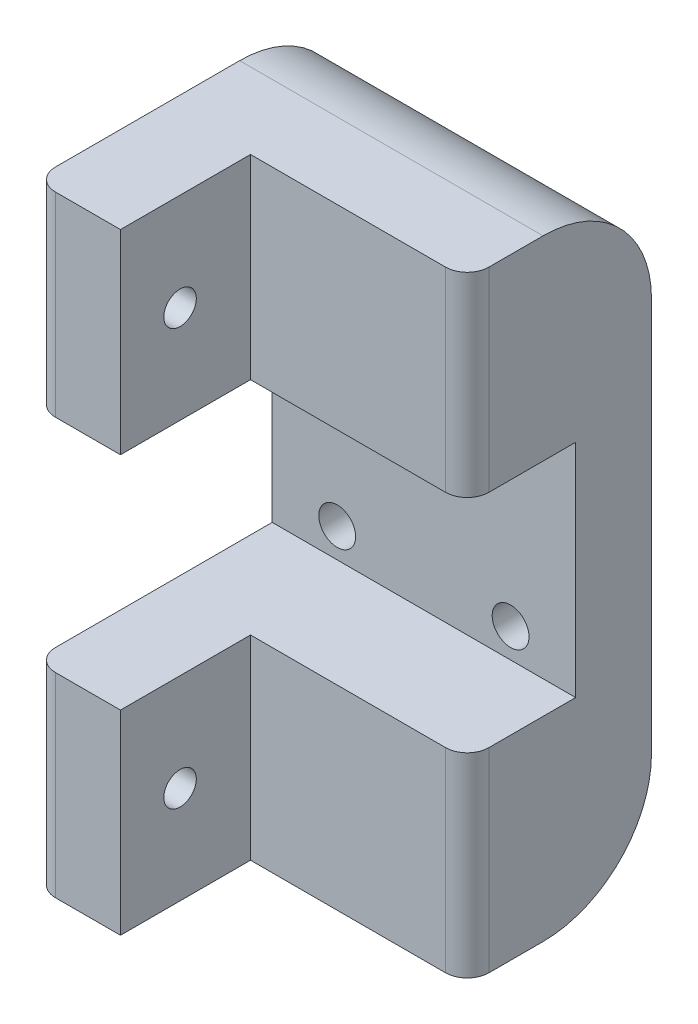
ISO-10303-21;
HEADER;
FILE_DESCRIPTION(('STEP AP214'),'2;1');
FILE_NAME('part.step','',(''),(''),'','','');
FILE_SCHEMA(('AUTOMOTIVE_DESIGN { 1 0 10303 214 1 1 1 1 }'));
ENDSEC;
DATA;
#1=APPLICATION_CONTEXT('core data for automotive mechanical design processes');
#2=APPLICATION_PROTOCOL_DEFINITION('international standard','automotive_design',2000,#1);
#3=PRODUCT_CONTEXT('',#1,'mechanical');
#4=PRODUCT('Part','Part','',(#3));
#5=PRODUCT_RELATED_PRODUCT_CATEGORY('part','',(#4));
#6=PRODUCT_DEFINITION_FORMATION('','',#4);
#7=PRODUCT_DEFINITION_CONTEXT('part definition',#1,'design');
#8=PRODUCT_DEFINITION('design','',#6,#7);
#9=PRODUCT_DEFINITION_SHAPE('','',#8);
#10=(LENGTH_UNIT() NAMED_UNIT(*) SI_UNIT(.MILLI.,.METRE.));
#11=(NAMED_UNIT(*) PLANE_ANGLE_UNIT() SI_UNIT($,.RADIAN.));
#12=(NAMED_UNIT(*) SI_UNIT($,.STERADIAN.) SOLID_ANGLE_UNIT());
#13=UNCERTAINTY_MEASURE_WITH_UNIT(LENGTH_MEASURE(1.E-05),#10,'distance_accuracy_value','');
#14=(GEOMETRIC_REPRESENTATION_CONTEXT(3) GLOBAL_UNCERTAINTY_ASSIGNED_CONTEXT((#13)) GLOBAL_UNIT_ASSIGNED_CONTEXT((#10,
#11,#12)) REPRESENTATION_CONTEXT('',''));
#15=CARTESIAN_POINT('',(0.,0.,0.));
#16=DIRECTION('',(0.,0.,1.));
#17=DIRECTION('',(1.,0.,0.));
#18=AXIS2_PLACEMENT_3D('',#15,#16,#17);
#19=CARTESIAN_POINT('',(0.,-18.,17.));
#20=DIRECTION('',(0.,0.,-1.));
#21=DIRECTION('',(-1.,0.,0.));
#22=AXIS2_PLACEMENT_3D('',#19,#20,#21);
#23=PLANE('',#22);
#24=DIRECTION('',(-1.,0.,0.));
#25=VECTOR('',#24,1.);
#26=CARTESIAN_POINT('',(0.,-18.,17.));
#27=LINE('',#26,#25);
#28=CARTESIAN_POINT('',(26.,-18.,17.));
#29=VERTEX_POINT('',#28);
#30=CARTESIAN_POINT('',(8.00000000000001,-18.,17.));
#31=VERTEX_POINT('',#30);
#32=EDGE_CURVE('E171',#29,#31,#27,.T.);
#33=ORIENTED_EDGE('',*,*,#32,.F.);
#34=DIRECTION('',(0.,1.,0.));
#35=VECTOR('',#34,1.);
#36=CARTESIAN_POINT('',(26.,-18.,17.));
#37=LINE('',#36,#35);
#38=CARTESIAN_POINT('',(26.,0.,17.));
#39=VERTEX_POINT('',#38);
#40=EDGE_CURVE('E327',#29,#39,#37,.T.);
#41=ORIENTED_EDGE('',*,*,#40,.T.);
#42=DIRECTION('',(-1.,0.,0.));
#43=VECTOR('',#42,1.);
#44=CARTESIAN_POINT('',(0.,0.,17.));
#45=LINE('',#44,#43);
#46=CARTESIAN_POINT('',(8.00000000000001,0.,17.));
#47=VERTEX_POINT('',#46);
#48=EDGE_CURVE('E235',#39,#47,#45,.T.);
#49=ORIENTED_EDGE('',*,*,#48,.T.);
#50=DIRECTION('',(0.,1.,0.));
#51=VECTOR('',#50,1.);
#52=CARTESIAN_POINT('',(8.00000000000001,0.,17.));
#53=LINE('',#52,#51);
#54=EDGE_CURVE('E164',#31,#47,#53,.T.);
#55=ORIENTED_EDGE('',*,*,#54,.F.);
#56=EDGE_LOOP('',(#33,#41,#49,#55));
#57=FACE_BOUND('',#56,.T.);
#58=ADVANCED_FACE('F35',(#57),#23,.F.);
#59=CARTESIAN_POINT('',(0.,38.4,17.));
#60=DIRECTION('',(0.,0.,-1.));
#61=DIRECTION('',(-1.,0.,0.));
#62=AXIS2_PLACEMENT_3D('',#59,#60,#61);
#63=PLANE('',#62);
#64=DIRECTION('',(1.,0.,0.));
#65=VECTOR('',#64,1.);
#66=CARTESIAN_POINT('',(0.,20.4,17.));
#67=LINE('',#66,#65);
#68=CARTESIAN_POINT('',(8.,20.4,17.));
#69=VERTEX_POINT('',#68);
#70=CARTESIAN_POINT('',(26.,20.4,17.));
#71=VERTEX_POINT('',#70);
#72=EDGE_CURVE('E257',#69,#71,#67,.T.);
#73=ORIENTED_EDGE('',*,*,#72,.T.);
#74=DIRECTION('',(0.,-1.,0.));
#75=VECTOR('',#74,1.);
#76=CARTESIAN_POINT('',(26.,38.4,17.));
#77=LINE('',#76,#75);
#78=CARTESIAN_POINT('',(26.,38.4,17.));
#79=VERTEX_POINT('',#78);
#80=EDGE_CURVE('E321',#71,#79,#77,.F.);
#81=ORIENTED_EDGE('',*,*,#80,.T.);
#82=DIRECTION('',(1.,0.,0.));
#83=VECTOR('',#82,1.);
#84=CARTESIAN_POINT('',(0.,38.4,17.));
#85=LINE('',#84,#83);
#86=CARTESIAN_POINT('',(8.,38.4,17.));
#87=VERTEX_POINT('',#86);
#88=EDGE_CURVE('E248',#87,#79,#85,.T.);
#89=ORIENTED_EDGE('',*,*,#88,.F.);
#90=DIRECTION('',(0.,1.,0.));
#91=VECTOR('',#90,1.);
#92=CARTESIAN_POINT('',(8.,38.4,17.));
#93=LINE('',#92,#91);
#94=EDGE_CURVE('E175',#69,#87,#93,.T.);
#95=ORIENTED_EDGE('',*,*,#94,.F.);
#96=EDGE_LOOP('',(#73,#81,#89,#95));
#97=FACE_BOUND('',#96,.T.);
#98=ADVANCED_FACE('F418',(#97),#63,.F.);
#99=CARTESIAN_POINT('',(0.,0.,7.));
#100=DIRECTION('',(1.,0.,0.));
#101=DIRECTION('',(0.,0.,-1.));
#102=AXIS2_PLACEMENT_3D('',#99,#100,#101);
#103=PLANE('',#102);
#104=CARTESIAN_POINT('',(0.,29.4,23.5));
#105=DIRECTION('',(-1.,0.,0.));
#106=DIRECTION('',(0.,0.,1.));
#107=AXIS2_PLACEMENT_3D('',#104,#105,#106);
#108=CIRCLE('',#107,1.5);
#109=CARTESIAN_POINT('',(0.,29.4,25.));
#110=VERTEX_POINT('',#109);
#111=EDGE_CURVE('E310',#110,#110,#108,.T.);
#112=ORIENTED_EDGE('',*,*,#111,.F.);
#113=EDGE_LOOP('',(#112));
#114=FACE_BOUND('',#113,.T.);
#115=CARTESIAN_POINT('',(0.,-9.,23.5));
#116=DIRECTION('',(-1.,0.,0.));
#117=DIRECTION('',(0.,0.,1.));
#118=AXIS2_PLACEMENT_3D('',#115,#116,#117);
#119=CIRCLE('',#118,1.5);
#120=CARTESIAN_POINT('',(0.,-9.,25.));
#121=VERTEX_POINT('',#120);
#122=EDGE_CURVE('E447',#121,#121,#119,.T.);
#123=ORIENTED_EDGE('',*,*,#122,.F.);
#124=EDGE_LOOP('',(#123));
#125=FACE_BOUND('',#124,.T.);
#126=DIRECTION('',(0.,0.,1.));
#127=VECTOR('',#126,1.);
#128=CARTESIAN_POINT('',(0.,20.4,0.));
#129=LINE('',#128,#127);
#130=CARTESIAN_POINT('',(0.,20.4,7.));
#131=VERTEX_POINT('',#130);
#132=CARTESIAN_POINT('',(0.,20.4,27.));
#133=VERTEX_POINT('',#132);
#134=EDGE_CURVE('E238',#131,#133,#129,.T.);
#135=ORIENTED_EDGE('',*,*,#134,.T.);
#136=DIRECTION('',(0.,-1.,0.));
#137=VECTOR('',#136,1.);
#138=CARTESIAN_POINT('',(0.,38.4,27.));
#139=LINE('',#138,#137);
#140=CARTESIAN_POINT('',(0.,38.4,27.));
#141=VERTEX_POINT('',#140);
#142=EDGE_CURVE('E43',#133,#141,#139,.F.);
#143=ORIENTED_EDGE('',*,*,#142,.T.);
#144=DIRECTION('',(0.,0.,1.));
#145=VECTOR('',#144,1.);
#146=CARTESIAN_POINT('',(0.,38.4,0.));
#147=LINE('',#146,#145);
#148=CARTESIAN_POINT('',(0.,38.4,10.));
#149=VERTEX_POINT('',#148);
#150=EDGE_CURVE('E245',#149,#141,#147,.T.);
#151=ORIENTED_EDGE('',*,*,#150,.F.);
#152=CARTESIAN_POINT('',(0.,28.4,10.));
#153=DIRECTION('',(1.,0.,0.));
#154=DIRECTION('',(0.,0.,-1.));
#155=AXIS2_PLACEMENT_3D('',#152,#153,#154);
#156=CIRCLE('',#155,10.);
#157=CARTESIAN_POINT('',(0.,28.4,0.));
#158=VERTEX_POINT('',#157);
#159=EDGE_CURVE('E298',#149,#158,#156,.F.);
#160=ORIENTED_EDGE('',*,*,#159,.T.);
#161=DIRECTION('',(0.,-1.,0.));
#162=VECTOR('',#161,1.);
#163=CARTESIAN_POINT('',(0.,0.,0.));
#164=LINE('',#163,#162);
#165=CARTESIAN_POINT('',(0.,-8.,0.));
#166=VERTEX_POINT('',#165);
#167=EDGE_CURVE('E254',#158,#166,#164,.T.);
#168=ORIENTED_EDGE('',*,*,#167,.T.);
#169=CARTESIAN_POINT('',(0.,-8.,10.));
#170=DIRECTION('',(1.,0.,0.));
#171=DIRECTION('',(0.,0.,-1.));
#172=AXIS2_PLACEMENT_3D('',#169,#170,#171);
#173=CIRCLE('',#172,10.);
#174=CARTESIAN_POINT('',(0.,-18.,10.));
#175=VERTEX_POINT('',#174);
#176=EDGE_CURVE('E300',#166,#175,#173,.F.);
#177=ORIENTED_EDGE('',*,*,#176,.T.);
#178=DIRECTION('',(0.,0.,-1.));
#179=VECTOR('',#178,1.);
#180=CARTESIAN_POINT('',(0.,-18.,17.));
#181=LINE('',#180,#179);
#182=CARTESIAN_POINT('',(0.,-18.,27.));
#183=VERTEX_POINT('',#182);
#184=EDGE_CURVE('E232',#183,#175,#181,.T.);
#185=ORIENTED_EDGE('',*,*,#184,.F.);
#186=DIRECTION('',(0.,-1.,0.));
#187=VECTOR('',#186,1.);
#188=CARTESIAN_POINT('',(0.,0.,27.));
#189=LINE('',#188,#187);
#190=CARTESIAN_POINT('',(0.,0.,27.));
#191=VERTEX_POINT('',#190);
#192=EDGE_CURVE('E340',#183,#191,#189,.F.);
#193=ORIENTED_EDGE('',*,*,#192,.T.);
#194=DIRECTION('',(0.,0.,-1.));
#195=VECTOR('',#194,1.);
#196=CARTESIAN_POINT('',(0.,0.,17.));
#197=LINE('',#196,#195);
#198=CARTESIAN_POINT('',(0.,0.,7.));
#199=VERTEX_POINT('',#198);
#200=EDGE_CURVE('E239',#191,#199,#197,.T.);
#201=ORIENTED_EDGE('',*,*,#200,.T.);
#202=DIRECTION('',(0.,-1.,0.));
#203=VECTOR('',#202,1.);
#204=CARTESIAN_POINT('',(0.,0.,7.));
#205=LINE('',#204,#203);
#206=EDGE_CURVE('E261',#131,#199,#205,.T.);
#207=ORIENTED_EDGE('',*,*,#206,.F.);
#208=EDGE_LOOP('',(#135,#143,#151,#160,#168,#177,#185,#193,#201,#207));
#209=FACE_BOUND('',#208,.T.);
#210=ADVANCED_FACE('F344',(#114,#125,#209),#103,.F.);
#211=CARTESIAN_POINT('',(28.,0.,7.));
#212=DIRECTION('',(-1.,0.,0.));
#213=DIRECTION('',(0.,0.,1.));
#214=AXIS2_PLACEMENT_3D('',#211,#212,#213);
#215=PLANE('',#214);
#216=DIRECTION('',(0.,0.,-1.));
#217=VECTOR('',#216,1.);
#218=CARTESIAN_POINT('',(28.,38.4,0.));
#219=LINE('',#218,#217);
#220=CARTESIAN_POINT('',(28.,38.4,15.));
#221=VERTEX_POINT('',#220);
#222=CARTESIAN_POINT('',(28.,38.4,10.));
#223=VERTEX_POINT('',#222);
#224=EDGE_CURVE('E252',#221,#223,#219,.T.);
#225=ORIENTED_EDGE('',*,*,#224,.F.);
#226=DIRECTION('',(0.,-1.,0.));
#227=VECTOR('',#226,1.);
#228=CARTESIAN_POINT('',(28.,0.,15.));
#229=LINE('',#228,#227);
#230=CARTESIAN_POINT('',(28.,20.4,15.));
#231=VERTEX_POINT('',#230);
#232=EDGE_CURVE('E314',#221,#231,#229,.T.);
#233=ORIENTED_EDGE('',*,*,#232,.T.);
#234=DIRECTION('',(0.,0.,-1.));
#235=VECTOR('',#234,1.);
#236=CARTESIAN_POINT('',(28.,20.4,0.));
#237=LINE('',#236,#235);
#238=CARTESIAN_POINT('',(28.,20.4,7.));
#239=VERTEX_POINT('',#238);
#240=EDGE_CURVE('E249',#231,#239,#237,.T.);
#241=ORIENTED_EDGE('',*,*,#240,.T.);
#242=DIRECTION('',(0.,1.,0.));
#243=VECTOR('',#242,1.);
#244=CARTESIAN_POINT('',(28.,0.,7.));
#245=LINE('',#244,#243);
#246=CARTESIAN_POINT('',(28.,0.,7.));
#247=VERTEX_POINT('',#246);
#248=EDGE_CURVE('E268',#247,#239,#245,.T.);
#249=ORIENTED_EDGE('',*,*,#248,.F.);
#250=DIRECTION('',(0.,0.,1.));
#251=VECTOR('',#250,1.);
#252=CARTESIAN_POINT('',(28.,0.,17.));
#253=LINE('',#252,#251);
#254=CARTESIAN_POINT('',(28.,0.,15.));
#255=VERTEX_POINT('',#254);
#256=EDGE_CURVE('E241',#247,#255,#253,.T.);
#257=ORIENTED_EDGE('',*,*,#256,.T.);
#258=DIRECTION('',(0.,1.,0.));
#259=VECTOR('',#258,1.);
#260=CARTESIAN_POINT('',(28.,0.,15.));
#261=LINE('',#260,#259);
#262=CARTESIAN_POINT('',(28.,-18.,15.));
#263=VERTEX_POINT('',#262);
#264=EDGE_CURVE('E306',#255,#263,#261,.F.);
#265=ORIENTED_EDGE('',*,*,#264,.T.);
#266=DIRECTION('',(0.,0.,1.));
#267=VECTOR('',#266,1.);
#268=CARTESIAN_POINT('',(28.,-18.,17.));
#269=LINE('',#268,#267);
#270=CARTESIAN_POINT('',(28.,-18.,10.));
#271=VERTEX_POINT('',#270);
#272=EDGE_CURVE('E234',#271,#263,#269,.T.);
#273=ORIENTED_EDGE('',*,*,#272,.F.);
#274=CARTESIAN_POINT('',(28.,-8.,10.));
#275=DIRECTION('',(-1.,0.,0.));
#276=DIRECTION('',(0.,0.,1.));
#277=AXIS2_PLACEMENT_3D('',#274,#275,#276);
#278=CIRCLE('',#277,10.);
#279=CARTESIAN_POINT('',(28.,-8.,0.));
#280=VERTEX_POINT('',#279);
#281=EDGE_CURVE('E292',#271,#280,#278,.F.);
#282=ORIENTED_EDGE('',*,*,#281,.T.);
#283=DIRECTION('',(0.,1.,0.));
#284=VECTOR('',#283,1.);
#285=CARTESIAN_POINT('',(28.,0.,0.));
#286=LINE('',#285,#284);
#287=CARTESIAN_POINT('',(28.,28.4,0.));
#288=VERTEX_POINT('',#287);
#289=EDGE_CURVE('E265',#280,#288,#286,.T.);
#290=ORIENTED_EDGE('',*,*,#289,.T.);
#291=CARTESIAN_POINT('',(28.,28.4,10.));
#292=DIRECTION('',(-1.,0.,0.));
#293=DIRECTION('',(0.,0.,1.));
#294=AXIS2_PLACEMENT_3D('',#291,#292,#293);
#295=CIRCLE('',#294,10.);
#296=EDGE_CURVE('E289',#288,#223,#295,.F.);
#297=ORIENTED_EDGE('',*,*,#296,.T.);
#298=EDGE_LOOP('',(#225,#233,#241,#249,#257,#265,#273,#282,#290,#297));
#299=FACE_BOUND('',#298,.T.);
#300=ADVANCED_FACE('F374',(#299),#215,.F.);
#301=CARTESIAN_POINT('',(0.,0.,7.));
#302=DIRECTION('',(0.,0.,-1.));
#303=DIRECTION('',(-1.,0.,0.));
#304=AXIS2_PLACEMENT_3D('',#301,#302,#303);
#305=PLANE('',#304);
#306=CARTESIAN_POINT('',(22.,17.7,7.));
#307=DIRECTION('',(0.,0.,-1.));
#308=DIRECTION('',(-1.,0.,0.));
#309=AXIS2_PLACEMENT_3D('',#306,#307,#308);
#310=CIRCLE('',#309,1.69999999999999);
#311=CARTESIAN_POINT('',(20.3,17.7,7.));
#312=VERTEX_POINT('',#311);
#313=EDGE_CURVE('E210',#312,#312,#310,.T.);
#314=ORIENTED_EDGE('',*,*,#313,.T.);
#315=EDGE_LOOP('',(#314));
#316=FACE_BOUND('',#315,.T.);
#317=CARTESIAN_POINT('',(6.,17.7,7.));
#318=DIRECTION('',(0.,0.,-1.));
#319=DIRECTION('',(-1.,0.,0.));
#320=AXIS2_PLACEMENT_3D('',#317,#318,#319);
#321=CIRCLE('',#320,1.69999999999999);
#322=CARTESIAN_POINT('',(4.30000000000001,17.7,7.));
#323=VERTEX_POINT('',#322);
#324=EDGE_CURVE('E217',#323,#323,#321,.T.);
#325=ORIENTED_EDGE('',*,*,#324,.T.);
#326=EDGE_LOOP('',(#325));
#327=FACE_BOUND('',#326,.T.);
#328=CARTESIAN_POINT('',(6.00000000000001,2.7,7.));
#329=DIRECTION('',(0.,0.,-1.));
#330=DIRECTION('',(-1.,0.,0.));
#331=AXIS2_PLACEMENT_3D('',#328,#329,#330);
#332=CIRCLE('',#331,1.69999999999999);
#333=CARTESIAN_POINT('',(4.30000000000001,2.7,7.));
#334=VERTEX_POINT('',#333);
#335=EDGE_CURVE('E224',#334,#334,#332,.T.);
#336=ORIENTED_EDGE('',*,*,#335,.T.);
#337=EDGE_LOOP('',(#336));
#338=FACE_BOUND('',#337,.T.);
#339=CARTESIAN_POINT('',(22.,2.7,7.));
#340=DIRECTION('',(0.,0.,-1.));
#341=DIRECTION('',(-1.,0.,0.));
#342=AXIS2_PLACEMENT_3D('',#339,#340,#341);
#343=CIRCLE('',#342,1.69999999999999);
#344=CARTESIAN_POINT('',(20.3,2.7,7.));
#345=VERTEX_POINT('',#344);
#346=EDGE_CURVE('E231',#345,#345,#343,.T.);
#347=ORIENTED_EDGE('',*,*,#346,.T.);
#348=EDGE_LOOP('',(#347));
#349=FACE_BOUND('',#348,.T.);
#350=ORIENTED_EDGE('',*,*,#206,.T.);
#351=DIRECTION('',(1.,0.,0.));
#352=VECTOR('',#351,1.);
#353=CARTESIAN_POINT('',(0.,0.,7.));
#354=LINE('',#353,#352);
#355=EDGE_CURVE('E264',#199,#247,#354,.T.);
#356=ORIENTED_EDGE('',*,*,#355,.T.);
#357=ORIENTED_EDGE('',*,*,#248,.T.);
#358=DIRECTION('',(-1.,0.,0.));
#359=VECTOR('',#358,1.);
#360=CARTESIAN_POINT('',(0.,20.4,7.));
#361=LINE('',#360,#359);
#362=EDGE_CURVE('E271',#239,#131,#361,.T.);
#363=ORIENTED_EDGE('',*,*,#362,.T.);
#364=EDGE_LOOP('',(#350,#356,#357,#363));
#365=FACE_BOUND('',#364,.T.);
#366=ADVANCED_FACE('F378',(#316,#327,#338,#349,#365),#305,.F.);
#367=CARTESIAN_POINT('',(0.,0.,0.));
#368=DIRECTION('',(0.,0.,-1.));
#369=DIRECTION('',(-1.,0.,0.));
#370=AXIS2_PLACEMENT_3D('',#367,#368,#369);
#371=PLANE('',#370);
#372=CARTESIAN_POINT('',(22.,17.7,0.));
#373=DIRECTION('',(0.,0.,-1.));
#374=DIRECTION('',(-1.,0.,0.));
#375=AXIS2_PLACEMENT_3D('',#372,#373,#374);
#376=CIRCLE('',#375,3.3);
#377=CARTESIAN_POINT('',(18.7,17.7,0.));
#378=VERTEX_POINT('',#377);
#379=EDGE_CURVE('E204',#378,#378,#376,.T.);
#380=ORIENTED_EDGE('',*,*,#379,.F.);
#381=EDGE_LOOP('',(#380));
#382=FACE_BOUND('',#381,.T.);
#383=CARTESIAN_POINT('',(6.,17.7,0.));
#384=DIRECTION('',(0.,0.,-1.));
#385=DIRECTION('',(-1.,0.,0.));
#386=AXIS2_PLACEMENT_3D('',#383,#384,#385);
#387=CIRCLE('',#386,3.3);
#388=CARTESIAN_POINT('',(2.7,17.7,0.));
#389=VERTEX_POINT('',#388);
#390=EDGE_CURVE('E211',#389,#389,#387,.T.);
#391=ORIENTED_EDGE('',*,*,#390,.F.);
#392=EDGE_LOOP('',(#391));
#393=FACE_BOUND('',#392,.T.);
#394=CARTESIAN_POINT('',(6.00000000000001,2.7,0.));
#395=DIRECTION('',(0.,0.,-1.));
#396=DIRECTION('',(-1.,0.,0.));
#397=AXIS2_PLACEMENT_3D('',#394,#395,#396);
#398=CIRCLE('',#397,3.3);
#399=CARTESIAN_POINT('',(2.7,2.7,0.));
#400=VERTEX_POINT('',#399);
#401=EDGE_CURVE('E218',#400,#400,#398,.T.);
#402=ORIENTED_EDGE('',*,*,#401,.F.);
#403=EDGE_LOOP('',(#402));
#404=FACE_BOUND('',#403,.T.);
#405=CARTESIAN_POINT('',(22.,2.7,0.));
#406=DIRECTION('',(0.,0.,-1.));
#407=DIRECTION('',(-1.,0.,0.));
#408=AXIS2_PLACEMENT_3D('',#405,#406,#407);
#409=CIRCLE('',#408,3.3);
#410=CARTESIAN_POINT('',(18.7,2.7,0.));
#411=VERTEX_POINT('',#410);
#412=EDGE_CURVE('E225',#411,#411,#409,.T.);
#413=ORIENTED_EDGE('',*,*,#412,.F.);
#414=EDGE_LOOP('',(#413));
#415=FACE_BOUND('',#414,.T.);
#416=ORIENTED_EDGE('',*,*,#289,.F.);
#417=DIRECTION('',(1.,0.,0.));
#418=VECTOR('',#417,1.);
#419=CARTESIAN_POINT('',(0.,-8.,0.));
#420=LINE('',#419,#418);
#421=EDGE_CURVE('E296',#280,#166,#420,.F.);
#422=ORIENTED_EDGE('',*,*,#421,.T.);
#423=ORIENTED_EDGE('',*,*,#167,.F.);
#424=DIRECTION('',(-1.,0.,0.));
#425=VECTOR('',#424,1.);
#426=CARTESIAN_POINT('',(0.,28.4,0.));
#427=LINE('',#426,#425);
#428=EDGE_CURVE('E294',#158,#288,#427,.F.);
#429=ORIENTED_EDGE('',*,*,#428,.T.);
#430=EDGE_LOOP('',(#416,#422,#423,#429));
#431=FACE_BOUND('',#430,.T.);
#432=ADVANCED_FACE('F399',(#382,#393,#404,#415,#431),#371,.T.);
#433=CARTESIAN_POINT('',(0.,38.4,0.));
#434=DIRECTION('',(0.,1.,0.));
#435=DIRECTION('',(0.,0.,1.));
#436=AXIS2_PLACEMENT_3D('',#433,#434,#435);
#437=PLANE('',#436);
#438=ORIENTED_EDGE('',*,*,#88,.T.);
#439=CARTESIAN_POINT('',(26.,38.4,15.));
#440=DIRECTION('',(0.,1.,0.));
#441=DIRECTION('',(0.,0.,1.));
#442=AXIS2_PLACEMENT_3D('',#439,#440,#441);
#443=CIRCLE('',#442,2.);
#444=EDGE_CURVE('E325',#79,#221,#443,.T.);
#445=ORIENTED_EDGE('',*,*,#444,.T.);
#446=ORIENTED_EDGE('',*,*,#224,.T.);
#447=DIRECTION('',(-1.,0.,0.));
#448=VECTOR('',#447,1.);
#449=CARTESIAN_POINT('',(0.,38.4,10.));
#450=LINE('',#449,#448);
#451=EDGE_CURVE('E303',#223,#149,#450,.T.);
#452=ORIENTED_EDGE('',*,*,#451,.T.);
#453=ORIENTED_EDGE('',*,*,#150,.T.);
#454=CARTESIAN_POINT('',(2.,38.4,27.));
#455=DIRECTION('',(0.,1.,0.));
#456=DIRECTION('',(0.,0.,1.));
#457=AXIS2_PLACEMENT_3D('',#454,#455,#456);
#458=CIRCLE('',#457,2.);
#459=CARTESIAN_POINT('',(2.,38.4,29.));
#460=VERTEX_POINT('',#459);
#461=EDGE_CURVE('E323',#141,#460,#458,.T.);
#462=ORIENTED_EDGE('',*,*,#461,.T.);
#463=DIRECTION('',(-1.,0.,0.));
#464=VECTOR('',#463,1.);
#465=CARTESIAN_POINT('',(0.,38.4,29.));
#466=LINE('',#465,#464);
#467=CARTESIAN_POINT('',(8.,38.4,29.));
#468=VERTEX_POINT('',#467);
#469=EDGE_CURVE('E193',#468,#460,#466,.T.);
#470=ORIENTED_EDGE('',*,*,#469,.F.);
#471=DIRECTION('',(0.,0.,-1.));
#472=VECTOR('',#471,1.);
#473=CARTESIAN_POINT('',(8.,38.4,29.));
#474=LINE('',#473,#472);
#475=EDGE_CURVE('E196',#468,#87,#474,.T.);
#476=ORIENTED_EDGE('',*,*,#475,.T.);
#477=EDGE_LOOP('',(#438,#445,#446,#452,#453,#462,#470,#476));
#478=FACE_BOUND('',#477,.T.);
#479=ADVANCED_FACE('F349',(#478),#437,.T.);
#480=CARTESIAN_POINT('',(0.,20.4,0.));
#481=DIRECTION('',(0.,1.,0.));
#482=DIRECTION('',(0.,0.,1.));
#483=AXIS2_PLACEMENT_3D('',#480,#481,#482);
#484=PLANE('',#483);
#485=ORIENTED_EDGE('',*,*,#240,.F.);
#486=CARTESIAN_POINT('',(26.,20.4,15.));
#487=DIRECTION('',(0.,1.,0.));
#488=DIRECTION('',(0.,0.,1.));
#489=AXIS2_PLACEMENT_3D('',#486,#487,#488);
#490=CIRCLE('',#489,2.);
#491=EDGE_CURVE('E319',#231,#71,#490,.F.);
#492=ORIENTED_EDGE('',*,*,#491,.T.);
#493=ORIENTED_EDGE('',*,*,#72,.F.);
#494=DIRECTION('',(0.,0.,-1.));
#495=VECTOR('',#494,1.);
#496=CARTESIAN_POINT('',(8.,20.4,29.));
#497=LINE('',#496,#495);
#498=CARTESIAN_POINT('',(8.,20.4,29.));
#499=VERTEX_POINT('',#498);
#500=EDGE_CURVE('E201',#499,#69,#497,.T.);
#501=ORIENTED_EDGE('',*,*,#500,.F.);
#502=DIRECTION('',(1.,0.,0.));
#503=VECTOR('',#502,1.);
#504=CARTESIAN_POINT('',(0.,20.4,29.));
#505=LINE('',#504,#503);
#506=CARTESIAN_POINT('',(2.,20.4,29.));
#507=VERTEX_POINT('',#506);
#508=EDGE_CURVE('E189',#507,#499,#505,.T.);
#509=ORIENTED_EDGE('',*,*,#508,.F.);
#510=CARTESIAN_POINT('',(2.,20.4,27.));
#511=DIRECTION('',(0.,1.,0.));
#512=DIRECTION('',(0.,0.,1.));
#513=AXIS2_PLACEMENT_3D('',#510,#511,#512);
#514=CIRCLE('',#513,2.);
#515=EDGE_CURVE('E317',#507,#133,#514,.F.);
#516=ORIENTED_EDGE('',*,*,#515,.T.);
#517=ORIENTED_EDGE('',*,*,#134,.F.);
#518=ORIENTED_EDGE('',*,*,#362,.F.);
#519=EDGE_LOOP('',(#485,#492,#493,#501,#509,#516,#517,#518));
#520=FACE_BOUND('',#519,.T.);
#521=ADVANCED_FACE('F360',(#520),#484,.F.);
#522=CARTESIAN_POINT('',(0.,-18.,0.));
#523=DIRECTION('',(0.,-1.,0.));
#524=DIRECTION('',(0.,0.,-1.));
#525=AXIS2_PLACEMENT_3D('',#522,#523,#524);
#526=PLANE('',#525);
#527=ORIENTED_EDGE('',*,*,#272,.T.);
#528=CARTESIAN_POINT('',(26.,-18.,15.));
#529=DIRECTION('',(0.,-1.,0.));
#530=DIRECTION('',(0.,0.,-1.));
#531=AXIS2_PLACEMENT_3D('',#528,#529,#530);
#532=CIRCLE('',#531,2.);
#533=EDGE_CURVE('E335',#263,#29,#532,.T.);
#534=ORIENTED_EDGE('',*,*,#533,.T.);
#535=ORIENTED_EDGE('',*,*,#32,.T.);
#536=DIRECTION('',(0.,0.,-1.));
#537=VECTOR('',#536,1.);
#538=CARTESIAN_POINT('',(8.00000000000001,-18.,29.));
#539=LINE('',#538,#537);
#540=CARTESIAN_POINT('',(8.00000000000001,-18.,29.));
#541=VERTEX_POINT('',#540);
#542=EDGE_CURVE('E167',#541,#31,#539,.T.);
#543=ORIENTED_EDGE('',*,*,#542,.F.);
#544=DIRECTION('',(1.,0.,0.));
#545=VECTOR('',#544,1.);
#546=CARTESIAN_POINT('',(0.,-18.,29.));
#547=LINE('',#546,#545);
#548=CARTESIAN_POINT('',(2.,-18.,29.));
#549=VERTEX_POINT('',#548);
#550=EDGE_CURVE('E157',#549,#541,#547,.T.);
#551=ORIENTED_EDGE('',*,*,#550,.F.);
#552=CARTESIAN_POINT('',(2.,-18.,27.));
#553=DIRECTION('',(0.,-1.,0.));
#554=DIRECTION('',(0.,0.,-1.));
#555=AXIS2_PLACEMENT_3D('',#552,#553,#554);
#556=CIRCLE('',#555,2.);
#557=EDGE_CURVE('E50',#549,#183,#556,.T.);
#558=ORIENTED_EDGE('',*,*,#557,.T.);
#559=ORIENTED_EDGE('',*,*,#184,.T.);
#560=DIRECTION('',(1.,0.,0.));
#561=VECTOR('',#560,1.);
#562=CARTESIAN_POINT('',(0.,-18.,10.));
#563=LINE('',#562,#561);
#564=EDGE_CURVE('E274',#175,#271,#563,.T.);
#565=ORIENTED_EDGE('',*,*,#564,.T.);
#566=EDGE_LOOP('',(#527,#534,#535,#543,#551,#558,#559,#565));
#567=FACE_BOUND('',#566,.T.);
#568=ADVANCED_FACE('F169',(#567),#526,.T.);
#569=CARTESIAN_POINT('',(0.,0.,0.));
#570=DIRECTION('',(0.,-1.,0.));
#571=DIRECTION('',(0.,0.,-1.));
#572=AXIS2_PLACEMENT_3D('',#569,#570,#571);
#573=PLANE('',#572);
#574=ORIENTED_EDGE('',*,*,#48,.F.);
#575=CARTESIAN_POINT('',(26.,0.,15.));
#576=DIRECTION('',(0.,-1.,0.));
#577=DIRECTION('',(0.,0.,-1.));
#578=AXIS2_PLACEMENT_3D('',#575,#576,#577);
#579=CIRCLE('',#578,2.);
#580=EDGE_CURVE('E332',#39,#255,#579,.F.);
#581=ORIENTED_EDGE('',*,*,#580,.T.);
#582=ORIENTED_EDGE('',*,*,#256,.F.);
#583=ORIENTED_EDGE('',*,*,#355,.F.);
#584=ORIENTED_EDGE('',*,*,#200,.F.);
#585=CARTESIAN_POINT('',(2.,0.,27.));
#586=DIRECTION('',(0.,-1.,0.));
#587=DIRECTION('',(0.,0.,-1.));
#588=AXIS2_PLACEMENT_3D('',#585,#586,#587);
#589=CIRCLE('',#588,2.);
#590=CARTESIAN_POINT('',(2.,0.,29.));
#591=VERTEX_POINT('',#590);
#592=EDGE_CURVE('E330',#191,#591,#589,.F.);
#593=ORIENTED_EDGE('',*,*,#592,.T.);
#594=DIRECTION('',(-1.,0.,0.));
#595=VECTOR('',#594,1.);
#596=CARTESIAN_POINT('',(0.,0.,29.));
#597=LINE('',#596,#595);
#598=CARTESIAN_POINT('',(8.00000000000001,0.,29.));
#599=VERTEX_POINT('',#598);
#600=EDGE_CURVE('E181',#599,#591,#597,.T.);
#601=ORIENTED_EDGE('',*,*,#600,.F.);
#602=DIRECTION('',(0.,0.,-1.));
#603=VECTOR('',#602,1.);
#604=CARTESIAN_POINT('',(8.00000000000001,0.,29.));
#605=LINE('',#604,#603);
#606=EDGE_CURVE('E176',#599,#47,#605,.T.);
#607=ORIENTED_EDGE('',*,*,#606,.T.);
#608=EDGE_LOOP('',(#574,#581,#582,#583,#584,#593,#601,#607));
#609=FACE_BOUND('',#608,.T.);
#610=ADVANCED_FACE('F389',(#609),#573,.F.);
#611=CARTESIAN_POINT('',(22.,2.7,0.));
#612=DIRECTION('',(0.,0.,-1.));
#613=DIRECTION('',(-1.,0.,0.));
#614=AXIS2_PLACEMENT_3D('',#611,#612,#613);
#615=CYLINDRICAL_SURFACE('',#614,1.69999999999999);
#616=CARTESIAN_POINT('',(22.,2.7,1.6));
#617=DIRECTION('',(0.,0.,-1.));
#618=DIRECTION('',(-1.,0.,0.));
#619=AXIS2_PLACEMENT_3D('',#616,#617,#618);
#620=CIRCLE('',#619,1.69999999999999);
#621=CARTESIAN_POINT('',(20.3,2.7,1.6));
#622=VERTEX_POINT('',#621);
#623=EDGE_CURVE('E228',#622,#622,#620,.T.);
#624=ORIENTED_EDGE('',*,*,#623,.T.);
#625=EDGE_LOOP('',(#624));
#626=FACE_BOUND('',#625,.T.);
#627=ORIENTED_EDGE('',*,*,#346,.F.);
#628=EDGE_LOOP('',(#627));
#629=FACE_BOUND('',#628,.T.);
#630=ADVANCED_FACE('F488',(#626,#629),#615,.F.);
#631=CARTESIAN_POINT('',(22.,2.7,0.));
#632=DIRECTION('',(0.,0.,-1.));
#633=DIRECTION('',(-1.,0.,0.));
#634=AXIS2_PLACEMENT_3D('',#631,#632,#633);
#635=CONICAL_SURFACE('',#634,3.3,0.785398163397451);
#636=ORIENTED_EDGE('',*,*,#623,.F.);
#637=EDGE_LOOP('',(#636));
#638=FACE_BOUND('',#637,.T.);
#639=ORIENTED_EDGE('',*,*,#412,.T.);
#640=EDGE_LOOP('',(#639));
#641=FACE_BOUND('',#640,.T.);
#642=ADVANCED_FACE('F484',(#638,#641),#635,.F.);
#643=CARTESIAN_POINT('',(6.00000000000001,2.7,0.));
#644=DIRECTION('',(0.,0.,-1.));
#645=DIRECTION('',(-1.,0.,0.));
#646=AXIS2_PLACEMENT_3D('',#643,#644,#645);
#647=CYLINDRICAL_SURFACE('',#646,1.69999999999999);
#648=CARTESIAN_POINT('',(6.00000000000001,2.7,1.6));
#649=DIRECTION('',(0.,0.,-1.));
#650=DIRECTION('',(-1.,0.,0.));
#651=AXIS2_PLACEMENT_3D('',#648,#649,#650);
#652=CIRCLE('',#651,1.69999999999999);
#653=CARTESIAN_POINT('',(4.30000000000002,2.7,1.6));
#654=VERTEX_POINT('',#653);
#655=EDGE_CURVE('E221',#654,#654,#652,.T.);
#656=ORIENTED_EDGE('',*,*,#655,.T.);
#657=EDGE_LOOP('',(#656));
#658=FACE_BOUND('',#657,.T.);
#659=ORIENTED_EDGE('',*,*,#335,.F.);
#660=EDGE_LOOP('',(#659));
#661=FACE_BOUND('',#660,.T.);
#662=ADVANCED_FACE('F480',(#658,#661),#647,.F.);
#663=CARTESIAN_POINT('',(6.00000000000001,2.7,0.));
#664=DIRECTION('',(0.,0.,-1.));
#665=DIRECTION('',(-1.,0.,0.));
#666=AXIS2_PLACEMENT_3D('',#663,#664,#665);
#667=CONICAL_SURFACE('',#666,3.3,0.78539816339745);
#668=ORIENTED_EDGE('',*,*,#655,.F.);
#669=EDGE_LOOP('',(#668));
#670=FACE_BOUND('',#669,.T.);
#671=ORIENTED_EDGE('',*,*,#401,.T.);
#672=EDGE_LOOP('',(#671));
#673=FACE_BOUND('',#672,.T.);
#674=ADVANCED_FACE('F476',(#670,#673),#667,.F.);
#675=CARTESIAN_POINT('',(6.,17.7,0.));
#676=DIRECTION('',(0.,0.,-1.));
#677=DIRECTION('',(-1.,0.,0.));
#678=AXIS2_PLACEMENT_3D('',#675,#676,#677);
#679=CYLINDRICAL_SURFACE('',#678,1.69999999999999);
#680=CARTESIAN_POINT('',(6.,17.7,1.6));
#681=DIRECTION('',(0.,0.,-1.));
#682=DIRECTION('',(-1.,0.,0.));
#683=AXIS2_PLACEMENT_3D('',#680,#681,#682);
#684=CIRCLE('',#683,1.69999999999999);
#685=CARTESIAN_POINT('',(4.30000000000001,17.7,1.6));
#686=VERTEX_POINT('',#685);
#687=EDGE_CURVE('E214',#686,#686,#684,.T.);
#688=ORIENTED_EDGE('',*,*,#687,.T.);
#689=EDGE_LOOP('',(#688));
#690=FACE_BOUND('',#689,.T.);
#691=ORIENTED_EDGE('',*,*,#324,.F.);
#692=EDGE_LOOP('',(#691));
#693=FACE_BOUND('',#692,.T.);
#694=ADVANCED_FACE('F472',(#690,#693),#679,.F.);
#695=CARTESIAN_POINT('',(6.,17.7,0.));
#696=DIRECTION('',(0.,0.,-1.));
#697=DIRECTION('',(-1.,0.,0.));
#698=AXIS2_PLACEMENT_3D('',#695,#696,#697);
#699=CONICAL_SURFACE('',#698,3.3,0.78539816339745);
#700=ORIENTED_EDGE('',*,*,#687,.F.);
#701=EDGE_LOOP('',(#700));
#702=FACE_BOUND('',#701,.T.);
#703=ORIENTED_EDGE('',*,*,#390,.T.);
#704=EDGE_LOOP('',(#703));
#705=FACE_BOUND('',#704,.T.);
#706=ADVANCED_FACE('F468',(#702,#705),#699,.F.);
#707=CARTESIAN_POINT('',(22.,17.7,0.));
#708=DIRECTION('',(0.,0.,-1.));
#709=DIRECTION('',(-1.,0.,0.));
#710=AXIS2_PLACEMENT_3D('',#707,#708,#709);
#711=CYLINDRICAL_SURFACE('',#710,1.69999999999999);
#712=CARTESIAN_POINT('',(22.,17.7,1.6));
#713=DIRECTION('',(0.,0.,-1.));
#714=DIRECTION('',(-1.,0.,0.));
#715=AXIS2_PLACEMENT_3D('',#712,#713,#714);
#716=CIRCLE('',#715,1.69999999999999);
#717=CARTESIAN_POINT('',(20.3,17.7,1.6));
#718=VERTEX_POINT('',#717);
#719=EDGE_CURVE('E207',#718,#718,#716,.T.);
#720=ORIENTED_EDGE('',*,*,#719,.T.);
#721=EDGE_LOOP('',(#720));
#722=FACE_BOUND('',#721,.T.);
#723=ORIENTED_EDGE('',*,*,#313,.F.);
#724=EDGE_LOOP('',(#723));
#725=FACE_BOUND('',#724,.T.);
#726=ADVANCED_FACE('F413',(#722,#725),#711,.F.);
#727=CARTESIAN_POINT('',(22.,17.7,0.));
#728=DIRECTION('',(0.,0.,-1.));
#729=DIRECTION('',(-1.,0.,0.));
#730=AXIS2_PLACEMENT_3D('',#727,#728,#729);
#731=CONICAL_SURFACE('',#730,3.3,0.78539816339745);
#732=ORIENTED_EDGE('',*,*,#719,.F.);
#733=EDGE_LOOP('',(#732));
#734=FACE_BOUND('',#733,.T.);
#735=ORIENTED_EDGE('',*,*,#379,.T.);
#736=EDGE_LOOP('',(#735));
#737=FACE_BOUND('',#736,.T.);
#738=ADVANCED_FACE('F405',(#734,#737),#731,.F.);
#739=CARTESIAN_POINT('',(0.,-8.,10.));
#740=DIRECTION('',(1.,0.,0.));
#741=DIRECTION('',(0.,0.,-1.));
#742=AXIS2_PLACEMENT_3D('',#739,#740,#741);
#743=CYLINDRICAL_SURFACE('',#742,10.);
#744=ORIENTED_EDGE('',*,*,#176,.F.);
#745=ORIENTED_EDGE('',*,*,#421,.F.);
#746=ORIENTED_EDGE('',*,*,#281,.F.);
#747=ORIENTED_EDGE('',*,*,#564,.F.);
#748=EDGE_LOOP('',(#744,#745,#746,#747));
#749=FACE_BOUND('',#748,.T.);
#750=ADVANCED_FACE('F402',(#749),#743,.T.);
#751=CARTESIAN_POINT('',(0.,28.4,10.));
#752=DIRECTION('',(-1.,0.,0.));
#753=DIRECTION('',(0.,0.,1.));
#754=AXIS2_PLACEMENT_3D('',#751,#752,#753);
#755=CYLINDRICAL_SURFACE('',#754,10.);
#756=ORIENTED_EDGE('',*,*,#296,.F.);
#757=ORIENTED_EDGE('',*,*,#428,.F.);
#758=ORIENTED_EDGE('',*,*,#159,.F.);
#759=ORIENTED_EDGE('',*,*,#451,.F.);
#760=EDGE_LOOP('',(#756,#757,#758,#759));
#761=FACE_BOUND('',#760,.T.);
#762=ADVANCED_FACE('F404',(#761),#755,.T.);
#763=CARTESIAN_POINT('',(8.,38.4,29.));
#764=DIRECTION('',(-1.,0.,0.));
#765=DIRECTION('',(0.,-1.,0.));
#766=AXIS2_PLACEMENT_3D('',#763,#764,#765);
#767=PLANE('',#766);
#768=CARTESIAN_POINT('',(8.,29.4,23.5));
#769=DIRECTION('',(-1.,0.,0.));
#770=DIRECTION('',(0.,-1.,0.));
#771=AXIS2_PLACEMENT_3D('',#768,#769,#770);
#772=CIRCLE('',#771,1.5);
#773=CARTESIAN_POINT('',(8.,27.9,23.5));
#774=VERTEX_POINT('',#773);
#775=EDGE_CURVE('E187',#774,#774,#772,.T.);
#776=ORIENTED_EDGE('',*,*,#775,.T.);
#777=EDGE_LOOP('',(#776));
#778=FACE_BOUND('',#777,.T.);
#779=ORIENTED_EDGE('',*,*,#94,.T.);
#780=ORIENTED_EDGE('',*,*,#475,.F.);
#781=DIRECTION('',(0.,1.,0.));
#782=VECTOR('',#781,1.);
#783=CARTESIAN_POINT('',(8.,38.4,29.));
#784=LINE('',#783,#782);
#785=EDGE_CURVE('E191',#499,#468,#784,.T.);
#786=ORIENTED_EDGE('',*,*,#785,.F.);
#787=ORIENTED_EDGE('',*,*,#500,.T.);
#788=EDGE_LOOP('',(#779,#780,#786,#787));
#789=FACE_BOUND('',#788,.T.);
#790=ADVANCED_FACE('F365',(#778,#789),#767,.F.);
#791=CARTESIAN_POINT('',(0.,0.,29.));
#792=DIRECTION('',(0.,0.,1.));
#793=DIRECTION('',(1.,0.,0.));
#794=AXIS2_PLACEMENT_3D('',#791,#792,#793);
#795=PLANE('',#794);
#796=ORIENTED_EDGE('',*,*,#469,.T.);
#797=DIRECTION('',(0.,-1.,0.));
#798=VECTOR('',#797,1.);
#799=CARTESIAN_POINT('',(2.,20.4,29.));
#800=LINE('',#799,#798);
#801=EDGE_CURVE('E337',#460,#507,#800,.T.);
#802=ORIENTED_EDGE('',*,*,#801,.T.);
#803=ORIENTED_EDGE('',*,*,#508,.T.);
#804=ORIENTED_EDGE('',*,*,#785,.T.);
#805=EDGE_LOOP('',(#796,#802,#803,#804));
#806=FACE_BOUND('',#805,.T.);
#807=ADVANCED_FACE('F356',(#806),#795,.T.);
#808=CARTESIAN_POINT('',(8.00000000000001,0.,29.));
#809=DIRECTION('',(-1.,0.,0.));
#810=DIRECTION('',(0.,-1.,0.));
#811=AXIS2_PLACEMENT_3D('',#808,#809,#810);
#812=PLANE('',#811);
#813=CARTESIAN_POINT('',(8.00000000000001,-9.,23.5));
#814=DIRECTION('',(-1.,0.,0.));
#815=DIRECTION('',(0.,-1.,0.));
#816=AXIS2_PLACEMENT_3D('',#813,#814,#815);
#817=CIRCLE('',#816,1.5);
#818=CARTESIAN_POINT('',(8.00000000000001,-10.5,23.5));
#819=VERTEX_POINT('',#818);
#820=EDGE_CURVE('E307',#819,#819,#817,.T.);
#821=ORIENTED_EDGE('',*,*,#820,.T.);
#822=EDGE_LOOP('',(#821));
#823=FACE_BOUND('',#822,.T.);
#824=ORIENTED_EDGE('',*,*,#54,.T.);
#825=ORIENTED_EDGE('',*,*,#606,.F.);
#826=DIRECTION('',(0.,1.,0.));
#827=VECTOR('',#826,1.);
#828=CARTESIAN_POINT('',(8.00000000000001,0.,29.));
#829=LINE('',#828,#827);
#830=EDGE_CURVE('E162',#541,#599,#829,.T.);
#831=ORIENTED_EDGE('',*,*,#830,.F.);
#832=ORIENTED_EDGE('',*,*,#542,.T.);
#833=EDGE_LOOP('',(#824,#825,#831,#832));
#834=FACE_BOUND('',#833,.T.);
#835=ADVANCED_FACE('F178',(#823,#834),#812,.F.);
#836=CARTESIAN_POINT('',(0.,0.,29.));
#837=DIRECTION('',(0.,0.,1.));
#838=DIRECTION('',(1.,0.,0.));
#839=AXIS2_PLACEMENT_3D('',#836,#837,#838);
#840=PLANE('',#839);
#841=ORIENTED_EDGE('',*,*,#600,.T.);
#842=DIRECTION('',(0.,-1.,0.));
#843=VECTOR('',#842,1.);
#844=CARTESIAN_POINT('',(2.,-18.,29.));
#845=LINE('',#844,#843);
#846=EDGE_CURVE('E11',#591,#549,#845,.T.);
#847=ORIENTED_EDGE('',*,*,#846,.T.);
#848=ORIENTED_EDGE('',*,*,#550,.T.);
#849=ORIENTED_EDGE('',*,*,#830,.T.);
#850=EDGE_LOOP('',(#841,#847,#848,#849));
#851=FACE_BOUND('',#850,.T.);
#852=ADVANCED_FACE('F160',(#851),#840,.T.);
#853=CARTESIAN_POINT('',(28.,-9.,23.5));
#854=DIRECTION('',(-1.,0.,0.));
#855=DIRECTION('',(0.,0.,1.));
#856=AXIS2_PLACEMENT_3D('',#853,#854,#855);
#857=CYLINDRICAL_SURFACE('',#856,1.5);
#858=ORIENTED_EDGE('',*,*,#122,.T.);
#859=EDGE_LOOP('',(#858));
#860=FACE_BOUND('',#859,.T.);
#861=ORIENTED_EDGE('',*,*,#820,.F.);
#862=EDGE_LOOP('',(#861));
#863=FACE_BOUND('',#862,.T.);
#864=ADVANCED_FACE('F454',(#860,#863),#857,.F.);
#865=CARTESIAN_POINT('',(28.,29.4,23.5));
#866=DIRECTION('',(-1.,0.,0.));
#867=DIRECTION('',(0.,0.,1.));
#868=AXIS2_PLACEMENT_3D('',#865,#866,#867);
#869=CYLINDRICAL_SURFACE('',#868,1.5);
#870=ORIENTED_EDGE('',*,*,#111,.T.);
#871=EDGE_LOOP('',(#870));
#872=FACE_BOUND('',#871,.T.);
#873=ORIENTED_EDGE('',*,*,#775,.F.);
#874=EDGE_LOOP('',(#873));
#875=FACE_BOUND('',#874,.T.);
#876=ADVANCED_FACE('F451',(#872,#875),#869,.F.);
#877=CARTESIAN_POINT('',(26.,0.,15.));
#878=DIRECTION('',(0.,-1.,0.));
#879=DIRECTION('',(0.,0.,-1.));
#880=AXIS2_PLACEMENT_3D('',#877,#878,#879);
#881=CYLINDRICAL_SURFACE('',#880,2.);
#882=ORIENTED_EDGE('',*,*,#444,.F.);
#883=ORIENTED_EDGE('',*,*,#80,.F.);
#884=ORIENTED_EDGE('',*,*,#491,.F.);
#885=ORIENTED_EDGE('',*,*,#232,.F.);
#886=EDGE_LOOP('',(#882,#883,#884,#885));
#887=FACE_BOUND('',#886,.T.);
#888=ADVANCED_FACE('F372',(#887),#881,.T.);
#889=CARTESIAN_POINT('',(26.,-18.,15.));
#890=DIRECTION('',(0.,1.,0.));
#891=DIRECTION('',(0.,0.,1.));
#892=AXIS2_PLACEMENT_3D('',#889,#890,#891);
#893=CYLINDRICAL_SURFACE('',#892,2.);
#894=ORIENTED_EDGE('',*,*,#533,.F.);
#895=ORIENTED_EDGE('',*,*,#264,.F.);
#896=ORIENTED_EDGE('',*,*,#580,.F.);
#897=ORIENTED_EDGE('',*,*,#40,.F.);
#898=EDGE_LOOP('',(#894,#895,#896,#897));
#899=FACE_BOUND('',#898,.T.);
#900=ADVANCED_FACE('F385',(#899),#893,.T.);
#901=CARTESIAN_POINT('',(2.,0.,27.));
#902=DIRECTION('',(0.,1.,0.));
#903=DIRECTION('',(0.,0.,1.));
#904=AXIS2_PLACEMENT_3D('',#901,#902,#903);
#905=CYLINDRICAL_SURFACE('',#904,2.);
#906=ORIENTED_EDGE('',*,*,#461,.F.);
#907=ORIENTED_EDGE('',*,*,#142,.F.);
#908=ORIENTED_EDGE('',*,*,#515,.F.);
#909=ORIENTED_EDGE('',*,*,#801,.F.);
#910=EDGE_LOOP('',(#906,#907,#908,#909));
#911=FACE_BOUND('',#910,.T.);
#912=ADVANCED_FACE('F353',(#911),#905,.T.);
#913=CARTESIAN_POINT('',(2.,0.,27.));
#914=DIRECTION('',(0.,1.,0.));
#915=DIRECTION('',(0.,0.,1.));
#916=AXIS2_PLACEMENT_3D('',#913,#914,#915);
#917=CYLINDRICAL_SURFACE('',#916,2.);
#918=ORIENTED_EDGE('',*,*,#592,.F.);
#919=ORIENTED_EDGE('',*,*,#192,.F.);
#920=ORIENTED_EDGE('',*,*,#557,.F.);
#921=ORIENTED_EDGE('',*,*,#846,.F.);
#922=EDGE_LOOP('',(#918,#919,#920,#921));
#923=FACE_BOUND('',#922,.T.);
#924=ADVANCED_FACE('F37',(#923),#917,.T.);
#925=CLOSED_SHELL('',(#58,#98,#210,#300,#366,#432,#479,#521,#568,#610,#630,#642,#662,#674,#694,
#706,#726,#738,#750,#762,#790,#807,#835,#852,#864,#876,#888,#900,#912,#924));
#926=MANIFOLD_SOLID_BREP('B2',#925);
#927=ADVANCED_BREP_SHAPE_REPRESENTATION('',(#18,#926),#14);
#928=SHAPE_DEFINITION_REPRESENTATION(#9,#927);
ENDSEC;
END-ISO-10303-21;
